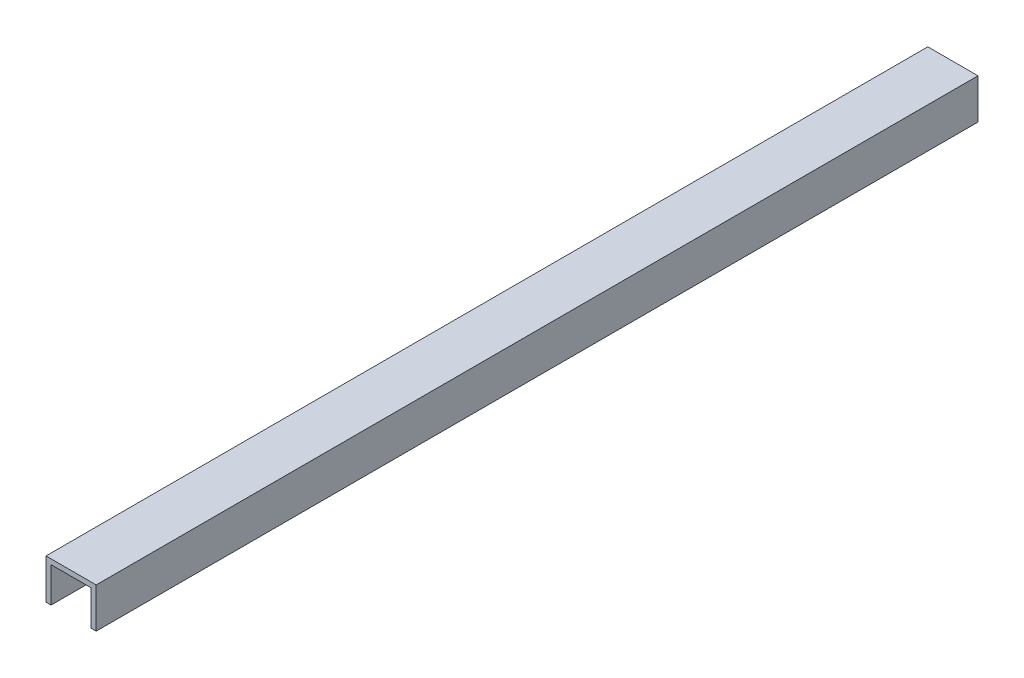
ISO-10303-21;
HEADER;
FILE_DESCRIPTION(('STEP AP214'),'2;1');
FILE_NAME('part.step','',(''),(''),'','','');
FILE_SCHEMA(('AUTOMOTIVE_DESIGN { 1 0 10303 214 1 1 1 1 }'));
ENDSEC;
DATA;
#1=APPLICATION_CONTEXT('core data for automotive mechanical design processes');
#2=APPLICATION_PROTOCOL_DEFINITION('international standard','automotive_design',2000,#1);
#3=PRODUCT_CONTEXT('',#1,'mechanical');
#4=PRODUCT('Part','Part','',(#3));
#5=PRODUCT_RELATED_PRODUCT_CATEGORY('part','',(#4));
#6=PRODUCT_DEFINITION_FORMATION('','',#4);
#7=PRODUCT_DEFINITION_CONTEXT('part definition',#1,'design');
#8=PRODUCT_DEFINITION('design','',#6,#7);
#9=PRODUCT_DEFINITION_SHAPE('','',#8);
#10=(LENGTH_UNIT() NAMED_UNIT(*) SI_UNIT(.MILLI.,.METRE.));
#11=(NAMED_UNIT(*) PLANE_ANGLE_UNIT() SI_UNIT($,.RADIAN.));
#12=(NAMED_UNIT(*) SI_UNIT($,.STERADIAN.) SOLID_ANGLE_UNIT());
#13=UNCERTAINTY_MEASURE_WITH_UNIT(LENGTH_MEASURE(1.E-05),#10,'distance_accuracy_value','');
#14=(GEOMETRIC_REPRESENTATION_CONTEXT(3) GLOBAL_UNCERTAINTY_ASSIGNED_CONTEXT((#13)) GLOBAL_UNIT_ASSIGNED_CONTEXT((#10,
#11,#12)) REPRESENTATION_CONTEXT('',''));
#15=CARTESIAN_POINT('',(0.,0.,0.));
#16=DIRECTION('',(0.,0.,1.));
#17=DIRECTION('',(1.,0.,0.));
#18=AXIS2_PLACEMENT_3D('',#15,#16,#17);
#19=CARTESIAN_POINT('',(0.,0.,-279.4));
#20=DIRECTION('',(-1.,0.,0.));
#21=DIRECTION('',(0.,0.,1.));
#22=AXIS2_PLACEMENT_3D('',#19,#20,#21);
#23=PLANE('',#22);
#24=DIRECTION('',(0.,-1.,0.));
#25=VECTOR('',#24,1.);
#26=CARTESIAN_POINT('',(0.,0.,0.));
#27=LINE('',#26,#25);
#28=CARTESIAN_POINT('',(0.,12.7,0.));
#29=VERTEX_POINT('',#28);
#30=CARTESIAN_POINT('',(0.,0.,0.));
#31=VERTEX_POINT('',#30);
#32=EDGE_CURVE('E165',#29,#31,#27,.T.);
#33=ORIENTED_EDGE('',*,*,#32,.F.);
#34=DIRECTION('',(0.,0.,1.));
#35=VECTOR('',#34,1.);
#36=CARTESIAN_POINT('',(0.,12.7,-279.4));
#37=LINE('',#36,#35);
#38=CARTESIAN_POINT('',(0.,12.7,-279.4));
#39=VERTEX_POINT('',#38);
#40=EDGE_CURVE('E11',#39,#29,#37,.T.);
#41=ORIENTED_EDGE('',*,*,#40,.F.);
#42=DIRECTION('',(0.,-1.,0.));
#43=VECTOR('',#42,1.);
#44=CARTESIAN_POINT('',(0.,0.,-279.4));
#45=LINE('',#44,#43);
#46=CARTESIAN_POINT('',(0.,0.,-279.4));
#47=VERTEX_POINT('',#46);
#48=EDGE_CURVE('E193',#39,#47,#45,.T.);
#49=ORIENTED_EDGE('',*,*,#48,.T.);
#50=DIRECTION('',(0.,0.,1.));
#51=VECTOR('',#50,1.);
#52=CARTESIAN_POINT('',(0.,0.,-279.4));
#53=LINE('',#52,#51);
#54=EDGE_CURVE('E48',#47,#31,#53,.T.);
#55=ORIENTED_EDGE('',*,*,#54,.T.);
#56=EDGE_LOOP('',(#33,#41,#49,#55));
#57=FACE_BOUND('',#56,.T.);
#58=ADVANCED_FACE('F45',(#57),#23,.T.);
#59=CARTESIAN_POINT('',(0.,12.7,-279.4));
#60=DIRECTION('',(0.,1.,0.));
#61=DIRECTION('',(0.,0.,1.));
#62=AXIS2_PLACEMENT_3D('',#59,#60,#61);
#63=PLANE('',#62);
#64=DIRECTION('',(-1.,0.,0.));
#65=VECTOR('',#64,1.);
#66=CARTESIAN_POINT('',(0.,12.7,0.));
#67=LINE('',#66,#65);
#68=CARTESIAN_POINT('',(15.9004,12.7,0.));
#69=VERTEX_POINT('',#68);
#70=EDGE_CURVE('E190',#69,#29,#67,.T.);
#71=ORIENTED_EDGE('',*,*,#70,.F.);
#72=DIRECTION('',(0.,0.,1.));
#73=VECTOR('',#72,1.);
#74=CARTESIAN_POINT('',(15.9004,12.7,-279.4));
#75=LINE('',#74,#73);
#76=CARTESIAN_POINT('',(15.9004,12.7,-279.4));
#77=VERTEX_POINT('',#76);
#78=EDGE_CURVE('E55',#77,#69,#75,.T.);
#79=ORIENTED_EDGE('',*,*,#78,.F.);
#80=DIRECTION('',(-1.,0.,0.));
#81=VECTOR('',#80,1.);
#82=CARTESIAN_POINT('',(0.,12.7,-279.4));
#83=LINE('',#82,#81);
#84=EDGE_CURVE('E150',#77,#39,#83,.T.);
#85=ORIENTED_EDGE('',*,*,#84,.T.);
#86=ORIENTED_EDGE('',*,*,#40,.T.);
#87=EDGE_LOOP('',(#71,#79,#85,#86));
#88=FACE_BOUND('',#87,.T.);
#89=ADVANCED_FACE('F211',(#88),#63,.T.);
#90=CARTESIAN_POINT('',(15.9004,0.,-279.4));
#91=DIRECTION('',(1.,0.,0.));
#92=DIRECTION('',(0.,0.,-1.));
#93=AXIS2_PLACEMENT_3D('',#90,#91,#92);
#94=PLANE('',#93);
#95=DIRECTION('',(0.,1.,0.));
#96=VECTOR('',#95,1.);
#97=CARTESIAN_POINT('',(15.9004,0.,0.));
#98=LINE('',#97,#96);
#99=CARTESIAN_POINT('',(15.9004,0.,0.));
#100=VERTEX_POINT('',#99);
#101=EDGE_CURVE('E136',#100,#69,#98,.T.);
#102=ORIENTED_EDGE('',*,*,#101,.F.);
#103=DIRECTION('',(0.,0.,1.));
#104=VECTOR('',#103,1.);
#105=CARTESIAN_POINT('',(15.9004,0.,-279.4));
#106=LINE('',#105,#104);
#107=CARTESIAN_POINT('',(15.9004,0.,-279.4));
#108=VERTEX_POINT('',#107);
#109=EDGE_CURVE('E131',#108,#100,#106,.T.);
#110=ORIENTED_EDGE('',*,*,#109,.F.);
#111=DIRECTION('',(0.,1.,0.));
#112=VECTOR('',#111,1.);
#113=CARTESIAN_POINT('',(15.9004,0.,-279.4));
#114=LINE('',#113,#112);
#115=EDGE_CURVE('E134',#108,#77,#114,.T.);
#116=ORIENTED_EDGE('',*,*,#115,.T.);
#117=ORIENTED_EDGE('',*,*,#78,.T.);
#118=EDGE_LOOP('',(#102,#110,#116,#117));
#119=FACE_BOUND('',#118,.T.);
#120=ADVANCED_FACE('F133',(#119),#94,.T.);
#121=CARTESIAN_POINT('',(14.3002,0.,-279.4));
#122=DIRECTION('',(0.,-1.,0.));
#123=DIRECTION('',(0.,0.,-1.));
#124=AXIS2_PLACEMENT_3D('',#121,#122,#123);
#125=PLANE('',#124);
#126=DIRECTION('',(1.,0.,0.));
#127=VECTOR('',#126,1.);
#128=CARTESIAN_POINT('',(14.3002,0.,0.));
#129=LINE('',#128,#127);
#130=CARTESIAN_POINT('',(14.3002,0.,0.));
#131=VERTEX_POINT('',#130);
#132=EDGE_CURVE('E185',#131,#100,#129,.T.);
#133=ORIENTED_EDGE('',*,*,#132,.F.);
#134=DIRECTION('',(0.,0.,1.));
#135=VECTOR('',#134,1.);
#136=CARTESIAN_POINT('',(14.3002,0.,-279.4));
#137=LINE('',#136,#135);
#138=CARTESIAN_POINT('',(14.3002,0.,-279.4));
#139=VERTEX_POINT('',#138);
#140=EDGE_CURVE('E142',#139,#131,#137,.T.);
#141=ORIENTED_EDGE('',*,*,#140,.F.);
#142=DIRECTION('',(1.,0.,0.));
#143=VECTOR('',#142,1.);
#144=CARTESIAN_POINT('',(14.3002,0.,-279.4));
#145=LINE('',#144,#143);
#146=EDGE_CURVE('E148',#139,#108,#145,.T.);
#147=ORIENTED_EDGE('',*,*,#146,.T.);
#148=ORIENTED_EDGE('',*,*,#109,.T.);
#149=EDGE_LOOP('',(#133,#141,#147,#148));
#150=FACE_BOUND('',#149,.T.);
#151=ADVANCED_FACE('F153',(#150),#125,.T.);
#152=CARTESIAN_POINT('',(14.3002,0.,-279.4));
#153=DIRECTION('',(-1.,0.,0.));
#154=DIRECTION('',(0.,0.,1.));
#155=AXIS2_PLACEMENT_3D('',#152,#153,#154);
#156=PLANE('',#155);
#157=DIRECTION('',(0.,-1.,0.));
#158=VECTOR('',#157,1.);
#159=CARTESIAN_POINT('',(14.3002,0.,0.));
#160=LINE('',#159,#158);
#161=CARTESIAN_POINT('',(14.3002,11.0998,0.));
#162=VERTEX_POINT('',#161);
#163=EDGE_CURVE('E181',#162,#131,#160,.T.);
#164=ORIENTED_EDGE('',*,*,#163,.F.);
#165=DIRECTION('',(0.,0.,1.));
#166=VECTOR('',#165,1.);
#167=CARTESIAN_POINT('',(14.3002,11.0998,-279.4));
#168=LINE('',#167,#166);
#169=CARTESIAN_POINT('',(14.3002,11.0998,-279.4));
#170=VERTEX_POINT('',#169);
#171=EDGE_CURVE('E199',#170,#162,#168,.T.);
#172=ORIENTED_EDGE('',*,*,#171,.F.);
#173=DIRECTION('',(0.,-1.,0.));
#174=VECTOR('',#173,1.);
#175=CARTESIAN_POINT('',(14.3002,0.,-279.4));
#176=LINE('',#175,#174);
#177=EDGE_CURVE('E155',#170,#139,#176,.T.);
#178=ORIENTED_EDGE('',*,*,#177,.T.);
#179=ORIENTED_EDGE('',*,*,#140,.T.);
#180=EDGE_LOOP('',(#164,#172,#178,#179));
#181=FACE_BOUND('',#180,.T.);
#182=ADVANCED_FACE('F224',(#181),#156,.T.);
#183=CARTESIAN_POINT('',(1.6002,11.0998,-279.4));
#184=DIRECTION('',(0.,-1.,0.));
#185=DIRECTION('',(0.,0.,-1.));
#186=AXIS2_PLACEMENT_3D('',#183,#184,#185);
#187=PLANE('',#186);
#188=DIRECTION('',(1.,0.,0.));
#189=VECTOR('',#188,1.);
#190=CARTESIAN_POINT('',(1.6002,11.0998,0.));
#191=LINE('',#190,#189);
#192=CARTESIAN_POINT('',(1.6002,11.0998,0.));
#193=VERTEX_POINT('',#192);
#194=EDGE_CURVE('E177',#193,#162,#191,.T.);
#195=ORIENTED_EDGE('',*,*,#194,.F.);
#196=DIRECTION('',(0.,0.,1.));
#197=VECTOR('',#196,1.);
#198=CARTESIAN_POINT('',(1.6002,11.0998,-279.4));
#199=LINE('',#198,#197);
#200=CARTESIAN_POINT('',(1.6002,11.0998,-279.4));
#201=VERTEX_POINT('',#200);
#202=EDGE_CURVE('E202',#201,#193,#199,.T.);
#203=ORIENTED_EDGE('',*,*,#202,.F.);
#204=DIRECTION('',(1.,0.,0.));
#205=VECTOR('',#204,1.);
#206=CARTESIAN_POINT('',(1.6002,11.0998,-279.4));
#207=LINE('',#206,#205);
#208=EDGE_CURVE('E160',#201,#170,#207,.T.);
#209=ORIENTED_EDGE('',*,*,#208,.T.);
#210=ORIENTED_EDGE('',*,*,#171,.T.);
#211=EDGE_LOOP('',(#195,#203,#209,#210));
#212=FACE_BOUND('',#211,.T.);
#213=ADVANCED_FACE('F227',(#212),#187,.T.);
#214=CARTESIAN_POINT('',(1.6002,0.,-279.4));
#215=DIRECTION('',(1.,0.,0.));
#216=DIRECTION('',(0.,0.,-1.));
#217=AXIS2_PLACEMENT_3D('',#214,#215,#216);
#218=PLANE('',#217);
#219=DIRECTION('',(0.,1.,0.));
#220=VECTOR('',#219,1.);
#221=CARTESIAN_POINT('',(1.6002,0.,0.));
#222=LINE('',#221,#220);
#223=CARTESIAN_POINT('',(1.6002,0.,0.));
#224=VERTEX_POINT('',#223);
#225=EDGE_CURVE('E173',#224,#193,#222,.T.);
#226=ORIENTED_EDGE('',*,*,#225,.F.);
#227=DIRECTION('',(0.,0.,1.));
#228=VECTOR('',#227,1.);
#229=CARTESIAN_POINT('',(1.6002,0.,-279.4));
#230=LINE('',#229,#228);
#231=CARTESIAN_POINT('',(1.6002,0.,-279.4));
#232=VERTEX_POINT('',#231);
#233=EDGE_CURVE('E204',#232,#224,#230,.T.);
#234=ORIENTED_EDGE('',*,*,#233,.F.);
#235=DIRECTION('',(0.,1.,0.));
#236=VECTOR('',#235,1.);
#237=CARTESIAN_POINT('',(1.6002,0.,-279.4));
#238=LINE('',#237,#236);
#239=EDGE_CURVE('E312',#232,#201,#238,.T.);
#240=ORIENTED_EDGE('',*,*,#239,.T.);
#241=ORIENTED_EDGE('',*,*,#202,.T.);
#242=EDGE_LOOP('',(#226,#234,#240,#241));
#243=FACE_BOUND('',#242,.T.);
#244=ADVANCED_FACE('F231',(#243),#218,.T.);
#245=CARTESIAN_POINT('',(0.,0.,-279.4));
#246=DIRECTION('',(0.,-1.,0.));
#247=DIRECTION('',(0.,0.,-1.));
#248=AXIS2_PLACEMENT_3D('',#245,#246,#247);
#249=PLANE('',#248);
#250=DIRECTION('',(1.,0.,0.));
#251=VECTOR('',#250,1.);
#252=CARTESIAN_POINT('',(0.,0.,0.));
#253=LINE('',#252,#251);
#254=EDGE_CURVE('E169',#31,#224,#253,.T.);
#255=ORIENTED_EDGE('',*,*,#254,.F.);
#256=ORIENTED_EDGE('',*,*,#54,.F.);
#257=DIRECTION('',(1.,0.,0.));
#258=VECTOR('',#257,1.);
#259=CARTESIAN_POINT('',(0.,0.,-279.4));
#260=LINE('',#259,#258);
#261=EDGE_CURVE('E314',#47,#232,#260,.T.);
#262=ORIENTED_EDGE('',*,*,#261,.T.);
#263=ORIENTED_EDGE('',*,*,#233,.T.);
#264=EDGE_LOOP('',(#255,#256,#262,#263));
#265=FACE_BOUND('',#264,.T.);
#266=ADVANCED_FACE('F208',(#265),#249,.T.);
#267=CARTESIAN_POINT('',(0.,0.,-279.4));
#268=DIRECTION('',(0.,0.,-1.));
#269=DIRECTION('',(-1.,0.,0.));
#270=AXIS2_PLACEMENT_3D('',#267,#268,#269);
#271=PLANE('',#270);
#272=ORIENTED_EDGE('',*,*,#48,.F.);
#273=ORIENTED_EDGE('',*,*,#84,.F.);
#274=ORIENTED_EDGE('',*,*,#115,.F.);
#275=ORIENTED_EDGE('',*,*,#146,.F.);
#276=ORIENTED_EDGE('',*,*,#177,.F.);
#277=ORIENTED_EDGE('',*,*,#208,.F.);
#278=ORIENTED_EDGE('',*,*,#239,.F.);
#279=ORIENTED_EDGE('',*,*,#261,.F.);
#280=EDGE_LOOP('',(#272,#273,#274,#275,#276,#277,#278,#279));
#281=FACE_BOUND('',#280,.T.);
#282=ADVANCED_FACE('F146',(#281),#271,.T.);
#283=CARTESIAN_POINT('',(0.,0.,0.));
#284=DIRECTION('',(0.,0.,-1.));
#285=DIRECTION('',(-1.,0.,0.));
#286=AXIS2_PLACEMENT_3D('',#283,#284,#285);
#287=PLANE('',#286);
#288=ORIENTED_EDGE('',*,*,#32,.T.);
#289=ORIENTED_EDGE('',*,*,#254,.T.);
#290=ORIENTED_EDGE('',*,*,#225,.T.);
#291=ORIENTED_EDGE('',*,*,#194,.T.);
#292=ORIENTED_EDGE('',*,*,#163,.T.);
#293=ORIENTED_EDGE('',*,*,#132,.T.);
#294=ORIENTED_EDGE('',*,*,#101,.T.);
#295=ORIENTED_EDGE('',*,*,#70,.T.);
#296=EDGE_LOOP('',(#288,#289,#290,#291,#292,#293,#294,#295));
#297=FACE_BOUND('',#296,.T.);
#298=ADVANCED_FACE('F210',(#297),#287,.F.);
#299=CLOSED_SHELL('',(#58,#89,#120,#151,#182,#213,#244,#266,#282,#298));
#300=MANIFOLD_SOLID_BREP('B2',#299);
#301=ADVANCED_BREP_SHAPE_REPRESENTATION('',(#18,#300),#14);
#302=SHAPE_DEFINITION_REPRESENTATION(#9,#301);
ENDSEC;
END-ISO-10303-21;
